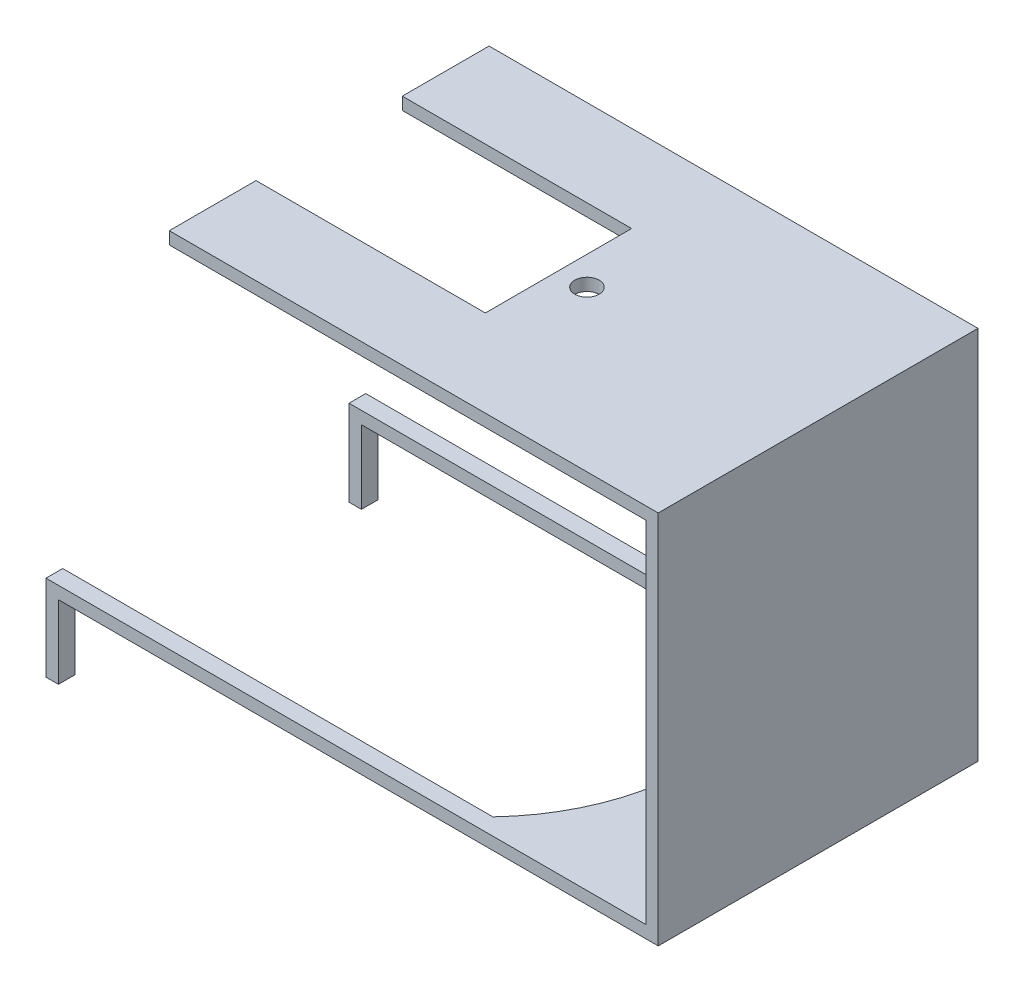
ISO-10303-21;
HEADER;
FILE_DESCRIPTION(('STEP AP214'),'2;1');
FILE_NAME('part.step','',(''),(''),'','','');
FILE_SCHEMA(('AUTOMOTIVE_DESIGN { 1 0 10303 214 1 1 1 1 }'));
ENDSEC;
DATA;
#1=APPLICATION_CONTEXT('core data for automotive mechanical design processes');
#2=APPLICATION_PROTOCOL_DEFINITION('international standard','automotive_design',2000,#1);
#3=PRODUCT_CONTEXT('',#1,'mechanical');
#4=PRODUCT('Part','Part','',(#3));
#5=PRODUCT_RELATED_PRODUCT_CATEGORY('part','',(#4));
#6=PRODUCT_DEFINITION_FORMATION('','',#4);
#7=PRODUCT_DEFINITION_CONTEXT('part definition',#1,'design');
#8=PRODUCT_DEFINITION('design','',#6,#7);
#9=PRODUCT_DEFINITION_SHAPE('','',#8);
#10=(LENGTH_UNIT() NAMED_UNIT(*) SI_UNIT(.MILLI.,.METRE.));
#11=(NAMED_UNIT(*) PLANE_ANGLE_UNIT() SI_UNIT($,.RADIAN.));
#12=(NAMED_UNIT(*) SI_UNIT($,.STERADIAN.) SOLID_ANGLE_UNIT());
#13=UNCERTAINTY_MEASURE_WITH_UNIT(LENGTH_MEASURE(1.E-05),#10,'distance_accuracy_value','');
#14=(GEOMETRIC_REPRESENTATION_CONTEXT(3) GLOBAL_UNCERTAINTY_ASSIGNED_CONTEXT((#13)) GLOBAL_UNIT_ASSIGNED_CONTEXT((#10,
#11,#12)) REPRESENTATION_CONTEXT('',''));
#15=CARTESIAN_POINT('',(0.,0.,0.));
#16=DIRECTION('',(0.,0.,1.));
#17=DIRECTION('',(1.,0.,0.));
#18=AXIS2_PLACEMENT_3D('',#15,#16,#17);
#19=CARTESIAN_POINT('',(-25.3109440696182,-29.7834720622153,25.8));
#20=DIRECTION('',(1.,0.,0.));
#21=DIRECTION('',(0.,0.,-1.));
#22=AXIS2_PLACEMENT_3D('',#19,#20,#21);
#23=PLANE('',#22);
#24=DIRECTION('',(0.,0.,-1.));
#25=VECTOR('',#24,1.);
#26=CARTESIAN_POINT('',(-25.3109440696182,-36.7018237477744,25.8));
#27=LINE('',#26,#25);
#28=CARTESIAN_POINT('',(-25.3109440696182,-36.7018237477745,1.35));
#29=VERTEX_POINT('',#28);
#30=CARTESIAN_POINT('',(-25.3109440696182,-36.7018237477744,0.));
#31=VERTEX_POINT('',#30);
#32=EDGE_CURVE('E196',#29,#31,#27,.T.);
#33=ORIENTED_EDGE('',*,*,#32,.F.);
#34=DIRECTION('',(0.,1.,0.));
#35=VECTOR('',#34,1.);
#36=CARTESIAN_POINT('',(-25.3109440696182,-36.7018237477745,1.35));
#37=LINE('',#36,#35);
#38=CARTESIAN_POINT('',(-25.3109440696182,-29.7834720622153,1.35));
#39=VERTEX_POINT('',#38);
#40=EDGE_CURVE('E233',#29,#39,#37,.T.);
#41=ORIENTED_EDGE('',*,*,#40,.T.);
#42=DIRECTION('',(0.,0.,-1.));
#43=VECTOR('',#42,1.);
#44=CARTESIAN_POINT('',(-25.3109440696182,-29.7834720622153,25.8));
#45=LINE('',#44,#43);
#46=CARTESIAN_POINT('',(-25.3109440696182,-29.7834720622153,0.));
#47=VERTEX_POINT('',#46);
#48=EDGE_CURVE('E195',#39,#47,#45,.T.);
#49=ORIENTED_EDGE('',*,*,#48,.T.);
#50=DIRECTION('',(0.,-1.,0.));
#51=VECTOR('',#50,1.);
#52=CARTESIAN_POINT('',(-25.3109440696182,-29.7834720622153,0.));
#53=LINE('',#52,#51);
#54=EDGE_CURVE('E306',#47,#31,#53,.T.);
#55=ORIENTED_EDGE('',*,*,#54,.T.);
#56=EDGE_LOOP('',(#33,#41,#49,#55));
#57=FACE_BOUND('',#56,.T.);
#58=ADVANCED_FACE('F34',(#57),#23,.F.);
#59=CARTESIAN_POINT('',(-25.3109440696182,-36.7018237477744,25.8));
#60=DIRECTION('',(0.,1.,0.));
#61=DIRECTION('',(-1.,0.,0.));
#62=AXIS2_PLACEMENT_3D('',#59,#60,#61);
#63=PLANE('',#62);
#64=DIRECTION('',(0.,0.,-1.));
#65=VECTOR('',#64,1.);
#66=CARTESIAN_POINT('',(-24.3109440696182,-36.7018237477744,25.8));
#67=LINE('',#66,#65);
#68=CARTESIAN_POINT('',(-24.3109440696182,-36.7018237477745,1.35));
#69=VERTEX_POINT('',#68);
#70=CARTESIAN_POINT('',(-24.3109440696182,-36.7018237477744,0.));
#71=VERTEX_POINT('',#70);
#72=EDGE_CURVE('E324',#69,#71,#67,.T.);
#73=ORIENTED_EDGE('',*,*,#72,.F.);
#74=DIRECTION('',(-1.,0.,0.));
#75=VECTOR('',#74,1.);
#76=CARTESIAN_POINT('',(-25.3109440696182,-36.7018237477745,1.35));
#77=LINE('',#76,#75);
#78=EDGE_CURVE('E180',#69,#29,#77,.T.);
#79=ORIENTED_EDGE('',*,*,#78,.T.);
#80=ORIENTED_EDGE('',*,*,#32,.T.);
#81=DIRECTION('',(1.,0.,0.));
#82=VECTOR('',#81,1.);
#83=CARTESIAN_POINT('',(-25.3109440696182,-36.7018237477744,0.));
#84=LINE('',#83,#82);
#85=EDGE_CURVE('E309',#31,#71,#84,.T.);
#86=ORIENTED_EDGE('',*,*,#85,.T.);
#87=EDGE_LOOP('',(#73,#79,#80,#86));
#88=FACE_BOUND('',#87,.T.);
#89=ADVANCED_FACE('F362',(#88),#63,.F.);
#90=CARTESIAN_POINT('',(-24.3109440696182,-36.7018237477744,25.8));
#91=DIRECTION('',(-1.,0.,0.));
#92=DIRECTION('',(0.,0.,1.));
#93=AXIS2_PLACEMENT_3D('',#90,#91,#92);
#94=PLANE('',#93);
#95=DIRECTION('',(0.,0.,-1.));
#96=VECTOR('',#95,1.);
#97=CARTESIAN_POINT('',(-24.3109440696182,-30.7834720622153,25.8));
#98=LINE('',#97,#96);
#99=CARTESIAN_POINT('',(-24.3109440696182,-30.7834720622153,1.35));
#100=VERTEX_POINT('',#99);
#101=CARTESIAN_POINT('',(-24.3109440696182,-30.7834720622153,0.));
#102=VERTEX_POINT('',#101);
#103=EDGE_CURVE('E322',#100,#102,#98,.T.);
#104=ORIENTED_EDGE('',*,*,#103,.F.);
#105=DIRECTION('',(0.,-1.,0.));
#106=VECTOR('',#105,1.);
#107=CARTESIAN_POINT('',(-24.3109440696182,-36.7018237477744,1.35));
#108=LINE('',#107,#106);
#109=EDGE_CURVE('E241',#100,#69,#108,.T.);
#110=ORIENTED_EDGE('',*,*,#109,.T.);
#111=ORIENTED_EDGE('',*,*,#72,.T.);
#112=DIRECTION('',(0.,1.,0.));
#113=VECTOR('',#112,1.);
#114=CARTESIAN_POINT('',(-24.3109440696182,-36.7018237477744,0.));
#115=LINE('',#114,#113);
#116=EDGE_CURVE('E312',#71,#102,#115,.T.);
#117=ORIENTED_EDGE('',*,*,#116,.T.);
#118=EDGE_LOOP('',(#104,#110,#111,#117));
#119=FACE_BOUND('',#118,.T.);
#120=ADVANCED_FACE('F331',(#119),#94,.F.);
#121=CARTESIAN_POINT('',(-15.3646838899602,-0.528688711027749,25.8));
#122=DIRECTION('',(1.,0.,0.));
#123=DIRECTION('',(0.,0.,-1.));
#124=AXIS2_PLACEMENT_3D('',#121,#122,#123);
#125=PLANE('',#124);
#126=DIRECTION('',(0.,0.,-1.));
#127=VECTOR('',#126,1.);
#128=CARTESIAN_POINT('',(-15.3646838899602,-1.52868871102775,25.8));
#129=LINE('',#128,#127);
#130=CARTESIAN_POINT('',(-15.3646838899602,-1.52868871102775,7.));
#131=VERTEX_POINT('',#130);
#132=CARTESIAN_POINT('',(-15.3646838899602,-1.52868871102775,0.));
#133=VERTEX_POINT('',#132);
#134=EDGE_CURVE('E209',#131,#133,#129,.T.);
#135=ORIENTED_EDGE('',*,*,#134,.F.);
#136=DIRECTION('',(0.,1.,0.));
#137=VECTOR('',#136,1.);
#138=CARTESIAN_POINT('',(-15.3646838899602,-23.4715691053607,7.));
#139=LINE('',#138,#137);
#140=CARTESIAN_POINT('',(-15.3646838899602,-0.528688711027749,7.));
#141=VERTEX_POINT('',#140);
#142=EDGE_CURVE('E265',#131,#141,#139,.T.);
#143=ORIENTED_EDGE('',*,*,#142,.T.);
#144=DIRECTION('',(0.,0.,-1.));
#145=VECTOR('',#144,1.);
#146=CARTESIAN_POINT('',(-15.3646838899602,-0.528688711027749,25.8));
#147=LINE('',#146,#145);
#148=CARTESIAN_POINT('',(-15.3646838899602,-0.528688711027749,0.));
#149=VERTEX_POINT('',#148);
#150=EDGE_CURVE('E213',#141,#149,#147,.T.);
#151=ORIENTED_EDGE('',*,*,#150,.T.);
#152=DIRECTION('',(0.,-1.,0.));
#153=VECTOR('',#152,1.);
#154=CARTESIAN_POINT('',(-15.3646838899602,-0.528688711027749,0.));
#155=LINE('',#154,#153);
#156=EDGE_CURVE('E296',#149,#133,#155,.T.);
#157=ORIENTED_EDGE('',*,*,#156,.T.);
#158=EDGE_LOOP('',(#135,#143,#151,#157));
#159=FACE_BOUND('',#158,.T.);
#160=ADVANCED_FACE('F364',(#159),#125,.F.);
#161=CARTESIAN_POINT('',(24.0848875196476,-0.528688711027744,25.8));
#162=DIRECTION('',(0.,-1.,0.));
#163=DIRECTION('',(1.,0.,0.));
#164=AXIS2_PLACEMENT_3D('',#161,#162,#163);
#165=PLANE('',#164);
#166=CARTESIAN_POINT('',(5.43531611003981,-0.528688711027747,12.9));
#167=DIRECTION('',(0.,1.,0.));
#168=DIRECTION('',(-1.,0.,0.));
#169=AXIS2_PLACEMENT_3D('',#166,#167,#168);
#170=CIRCLE('',#169,0.986321187116857);
#171=CARTESIAN_POINT('',(4.44899492292295,-0.528688711027747,12.9));
#172=VERTEX_POINT('',#171);
#173=EDGE_CURVE('E245',#172,#172,#170,.T.);
#174=ORIENTED_EDGE('',*,*,#173,.F.);
#175=EDGE_LOOP('',(#174));
#176=FACE_BOUND('',#175,.T.);
#177=ORIENTED_EDGE('',*,*,#150,.F.);
#178=DIRECTION('',(-1.,0.,0.));
#179=VECTOR('',#178,1.);
#180=CARTESIAN_POINT('',(3.13531611003981,-0.528688711027747,7.));
#181=LINE('',#180,#179);
#182=CARTESIAN_POINT('',(3.13531611003981,-0.528688711027747,7.));
#183=VERTEX_POINT('',#182);
#184=EDGE_CURVE('E244',#183,#141,#181,.T.);
#185=ORIENTED_EDGE('',*,*,#184,.F.);
#186=DIRECTION('',(0.,0.,-1.));
#187=VECTOR('',#186,1.);
#188=CARTESIAN_POINT('',(3.13531611003981,-0.528688711027747,18.8));
#189=LINE('',#188,#187);
#190=CARTESIAN_POINT('',(3.13531611003981,-0.528688711027747,18.8));
#191=VERTEX_POINT('',#190);
#192=EDGE_CURVE('E262',#191,#183,#189,.T.);
#193=ORIENTED_EDGE('',*,*,#192,.F.);
#194=DIRECTION('',(1.,0.,0.));
#195=VECTOR('',#194,1.);
#196=CARTESIAN_POINT('',(-15.3646838899602,-0.528688711027749,18.8));
#197=LINE('',#196,#195);
#198=CARTESIAN_POINT('',(-15.3646838899602,-0.528688711027749,18.8));
#199=VERTEX_POINT('',#198);
#200=EDGE_CURVE('E260',#199,#191,#197,.T.);
#201=ORIENTED_EDGE('',*,*,#200,.F.);
#202=CARTESIAN_POINT('',(-15.3646838899602,-0.528688711027749,25.8));
#203=VERTEX_POINT('',#202);
#204=EDGE_CURVE('E214',#203,#199,#147,.T.);
#205=ORIENTED_EDGE('',*,*,#204,.F.);
#206=DIRECTION('',(-1.,0.,0.));
#207=VECTOR('',#206,1.);
#208=CARTESIAN_POINT('',(24.0848875196476,-0.528688711027744,25.8));
#209=LINE('',#208,#207);
#210=CARTESIAN_POINT('',(24.0848875196476,-0.528688711027744,25.8));
#211=VERTEX_POINT('',#210);
#212=EDGE_CURVE('E272',#211,#203,#209,.T.);
#213=ORIENTED_EDGE('',*,*,#212,.F.);
#214=DIRECTION('',(0.,0.,-1.));
#215=VECTOR('',#214,1.);
#216=CARTESIAN_POINT('',(24.0848875196476,-0.528688711027744,25.8));
#217=LINE('',#216,#215);
#218=CARTESIAN_POINT('',(24.0848875196476,-0.528688711027744,0.));
#219=VERTEX_POINT('',#218);
#220=EDGE_CURVE('E293',#211,#219,#217,.T.);
#221=ORIENTED_EDGE('',*,*,#220,.T.);
#222=DIRECTION('',(-1.,0.,0.));
#223=VECTOR('',#222,1.);
#224=CARTESIAN_POINT('',(24.0848875196476,-0.528688711027744,0.));
#225=LINE('',#224,#223);
#226=EDGE_CURVE('E252',#219,#149,#225,.T.);
#227=ORIENTED_EDGE('',*,*,#226,.T.);
#228=EDGE_LOOP('',(#177,#185,#193,#201,#205,#213,#221,#227));
#229=FACE_BOUND('',#228,.T.);
#230=ADVANCED_FACE('F36',(#176,#229),#165,.F.);
#231=ORIENTED_EDGE('',*,*,#204,.T.);
#232=DIRECTION('',(0.,1.,0.));
#233=VECTOR('',#232,1.);
#234=CARTESIAN_POINT('',(-15.3646838899602,-23.4715691053607,18.8));
#235=LINE('',#234,#233);
#236=CARTESIAN_POINT('',(-15.3646838899602,-1.52868871102775,18.8));
#237=VERTEX_POINT('',#236);
#238=EDGE_CURVE('E268',#237,#199,#235,.T.);
#239=ORIENTED_EDGE('',*,*,#238,.F.);
#240=CARTESIAN_POINT('',(-15.3646838899602,-1.52868871102775,25.8));
#241=VERTEX_POINT('',#240);
#242=EDGE_CURVE('E210',#241,#237,#129,.T.);
#243=ORIENTED_EDGE('',*,*,#242,.F.);
#244=DIRECTION('',(0.,-1.,0.));
#245=VECTOR('',#244,1.);
#246=CARTESIAN_POINT('',(-15.3646838899602,-0.528688711027749,25.8));
#247=LINE('',#246,#245);
#248=EDGE_CURVE('E275',#203,#241,#247,.T.);
#249=ORIENTED_EDGE('',*,*,#248,.F.);
#250=EDGE_LOOP('',(#231,#239,#243,#249));
#251=FACE_BOUND('',#250,.T.);
#252=ADVANCED_FACE('F390',(#251),#125,.F.);
#253=CARTESIAN_POINT('',(-15.3646838899602,-1.52868871102775,25.8));
#254=DIRECTION('',(0.,1.,0.));
#255=DIRECTION('',(0.,0.,1.));
#256=AXIS2_PLACEMENT_3D('',#253,#254,#255);
#257=PLANE('',#256);
#258=CARTESIAN_POINT('',(5.43531611003981,-1.52868871102775,12.9));
#259=DIRECTION('',(0.,1.,0.));
#260=DIRECTION('',(0.,0.,1.));
#261=AXIS2_PLACEMENT_3D('',#258,#259,#260);
#262=CIRCLE('',#261,0.986321187116857);
#263=CARTESIAN_POINT('',(5.43531611003981,-1.52868871102775,13.8863211871169));
#264=VERTEX_POINT('',#263);
#265=EDGE_CURVE('E248',#264,#264,#262,.F.);
#266=ORIENTED_EDGE('',*,*,#265,.F.);
#267=EDGE_LOOP('',(#266));
#268=FACE_BOUND('',#267,.T.);
#269=DIRECTION('',(0.,0.,1.));
#270=VECTOR('',#269,1.);
#271=CARTESIAN_POINT('',(3.13531611003981,-1.52868871102775,18.8));
#272=LINE('',#271,#270);
#273=CARTESIAN_POINT('',(3.13531611003981,-1.52868871102775,7.));
#274=VERTEX_POINT('',#273);
#275=CARTESIAN_POINT('',(3.13531611003981,-1.52868871102775,18.8));
#276=VERTEX_POINT('',#275);
#277=EDGE_CURVE('E255',#274,#276,#272,.T.);
#278=ORIENTED_EDGE('',*,*,#277,.F.);
#279=DIRECTION('',(1.,0.,0.));
#280=VECTOR('',#279,1.);
#281=CARTESIAN_POINT('',(3.13531611003981,-1.52868871102775,7.));
#282=LINE('',#281,#280);
#283=EDGE_CURVE('E249',#131,#274,#282,.T.);
#284=ORIENTED_EDGE('',*,*,#283,.F.);
#285=ORIENTED_EDGE('',*,*,#134,.T.);
#286=DIRECTION('',(1.,0.,0.));
#287=VECTOR('',#286,1.);
#288=CARTESIAN_POINT('',(-15.3646838899602,-1.52868871102775,0.));
#289=LINE('',#288,#287);
#290=CARTESIAN_POINT('',(23.0848875196476,-1.52868871102775,0.));
#291=VERTEX_POINT('',#290);
#292=EDGE_CURVE('E299',#133,#291,#289,.T.);
#293=ORIENTED_EDGE('',*,*,#292,.T.);
#294=DIRECTION('',(0.,0.,-1.));
#295=VECTOR('',#294,1.);
#296=CARTESIAN_POINT('',(23.0848875196476,-1.52868871102775,25.8));
#297=LINE('',#296,#295);
#298=CARTESIAN_POINT('',(23.0848875196476,-1.52868871102775,25.8));
#299=VERTEX_POINT('',#298);
#300=EDGE_CURVE('E206',#299,#291,#297,.T.);
#301=ORIENTED_EDGE('',*,*,#300,.F.);
#302=DIRECTION('',(1.,0.,0.));
#303=VECTOR('',#302,1.);
#304=CARTESIAN_POINT('',(-15.3646838899602,-1.52868871102775,25.8));
#305=LINE('',#304,#303);
#306=EDGE_CURVE('E278',#241,#299,#305,.T.);
#307=ORIENTED_EDGE('',*,*,#306,.F.);
#308=ORIENTED_EDGE('',*,*,#242,.T.);
#309=DIRECTION('',(-1.,0.,0.));
#310=VECTOR('',#309,1.);
#311=CARTESIAN_POINT('',(-15.3646838899602,-1.52868871102775,18.8));
#312=LINE('',#311,#310);
#313=EDGE_CURVE('E253',#276,#237,#312,.T.);
#314=ORIENTED_EDGE('',*,*,#313,.F.);
#315=EDGE_LOOP('',(#278,#284,#285,#293,#301,#307,#308,#314));
#316=FACE_BOUND('',#315,.T.);
#317=ADVANCED_FACE('F384',(#268,#316),#257,.F.);
#318=CARTESIAN_POINT('',(23.0848875196476,-1.52868871102775,25.8));
#319=DIRECTION('',(1.,0.,0.));
#320=DIRECTION('',(0.,1.,0.));
#321=AXIS2_PLACEMENT_3D('',#318,#319,#320);
#322=PLANE('',#321);
#323=DIRECTION('',(0.,-1.,0.));
#324=VECTOR('',#323,1.);
#325=CARTESIAN_POINT('',(23.0848875196476,-1.52868871102775,0.));
#326=LINE('',#325,#324);
#327=CARTESIAN_POINT('',(23.0848875196476,-29.7834720622153,0.));
#328=VERTEX_POINT('',#327);
#329=EDGE_CURVE('E301',#291,#328,#326,.T.);
#330=ORIENTED_EDGE('',*,*,#329,.T.);
#331=DIRECTION('',(0.,0.,-1.));
#332=VECTOR('',#331,1.);
#333=CARTESIAN_POINT('',(23.0848875196476,-29.7834720622153,25.8));
#334=LINE('',#333,#332);
#335=CARTESIAN_POINT('',(23.0848875196476,-29.7834720622153,25.8));
#336=VERTEX_POINT('',#335);
#337=EDGE_CURVE('E203',#336,#328,#334,.T.);
#338=ORIENTED_EDGE('',*,*,#337,.F.);
#339=DIRECTION('',(0.,-1.,0.));
#340=VECTOR('',#339,1.);
#341=CARTESIAN_POINT('',(23.0848875196476,-1.52868871102775,25.8));
#342=LINE('',#341,#340);
#343=EDGE_CURVE('E280',#299,#336,#342,.T.);
#344=ORIENTED_EDGE('',*,*,#343,.F.);
#345=ORIENTED_EDGE('',*,*,#300,.T.);
#346=EDGE_LOOP('',(#330,#338,#344,#345));
#347=FACE_BOUND('',#346,.T.);
#348=ADVANCED_FACE('F379',(#347),#322,.F.);
#349=CARTESIAN_POINT('',(23.0848875196476,-29.7834720622153,25.8));
#350=DIRECTION('',(0.,-1.,0.));
#351=DIRECTION('',(1.,0.,0.));
#352=AXIS2_PLACEMENT_3D('',#349,#350,#351);
#353=PLANE('',#352);
#354=ORIENTED_EDGE('',*,*,#48,.F.);
#355=DIRECTION('',(-1.,0.,0.));
#356=VECTOR('',#355,1.);
#357=CARTESIAN_POINT('',(-25.3109440696182,-29.7834720622153,1.35));
#358=LINE('',#357,#356);
#359=CARTESIAN_POINT('',(9.39139752926901,-29.7834720622153,1.35));
#360=VERTEX_POINT('',#359);
#361=EDGE_CURVE('E181',#360,#39,#358,.T.);
#362=ORIENTED_EDGE('',*,*,#361,.F.);
#363=CARTESIAN_POINT('',(-2.7809440696182,-29.7834720622153,12.9));
#364=DIRECTION('',(0.,1.,0.));
#365=DIRECTION('',(-1.,0.,0.));
#366=AXIS2_PLACEMENT_3D('',#363,#364,#365);
#367=CIRCLE('',#366,16.78);
#368=CARTESIAN_POINT('',(9.39139752926902,-29.7834720622153,24.45));
#369=VERTEX_POINT('',#368);
#370=EDGE_CURVE('E230',#369,#360,#367,.T.);
#371=ORIENTED_EDGE('',*,*,#370,.F.);
#372=DIRECTION('',(1.,0.,0.));
#373=VECTOR('',#372,1.);
#374=CARTESIAN_POINT('',(9.39139752926902,-29.7834720622153,24.45));
#375=LINE('',#374,#373);
#376=CARTESIAN_POINT('',(-25.3109440696182,-29.7834720622153,24.45));
#377=VERTEX_POINT('',#376);
#378=EDGE_CURVE('E544',#377,#369,#375,.T.);
#379=ORIENTED_EDGE('',*,*,#378,.F.);
#380=CARTESIAN_POINT('',(-25.3109440696182,-29.7834720622153,25.8));
#381=VERTEX_POINT('',#380);
#382=EDGE_CURVE('E191',#381,#377,#45,.T.);
#383=ORIENTED_EDGE('',*,*,#382,.F.);
#384=DIRECTION('',(-1.,0.,0.));
#385=VECTOR('',#384,1.);
#386=CARTESIAN_POINT('',(23.0848875196476,-29.7834720622153,25.8));
#387=LINE('',#386,#385);
#388=EDGE_CURVE('E282',#336,#381,#387,.T.);
#389=ORIENTED_EDGE('',*,*,#388,.F.);
#390=ORIENTED_EDGE('',*,*,#337,.T.);
#391=DIRECTION('',(-1.,0.,0.));
#392=VECTOR('',#391,1.);
#393=CARTESIAN_POINT('',(23.0848875196476,-29.7834720622153,0.));
#394=LINE('',#393,#392);
#395=EDGE_CURVE('E303',#328,#47,#394,.T.);
#396=ORIENTED_EDGE('',*,*,#395,.T.);
#397=EDGE_LOOP('',(#354,#362,#371,#379,#383,#389,#390,#396));
#398=FACE_BOUND('',#397,.T.);
#399=ADVANCED_FACE('F375',(#398),#353,.F.);
#400=ORIENTED_EDGE('',*,*,#382,.T.);
#401=DIRECTION('',(0.,1.,0.));
#402=VECTOR('',#401,1.);
#403=CARTESIAN_POINT('',(-25.3109440696182,-36.7018237477745,24.45));
#404=LINE('',#403,#402);
#405=CARTESIAN_POINT('',(-25.3109440696182,-36.7018237477745,24.45));
#406=VERTEX_POINT('',#405);
#407=EDGE_CURVE('E172',#406,#377,#404,.T.);
#408=ORIENTED_EDGE('',*,*,#407,.F.);
#409=CARTESIAN_POINT('',(-25.3109440696182,-36.7018237477744,25.8));
#410=VERTEX_POINT('',#409);
#411=EDGE_CURVE('E188',#410,#406,#27,.T.);
#412=ORIENTED_EDGE('',*,*,#411,.F.);
#413=DIRECTION('',(0.,-1.,0.));
#414=VECTOR('',#413,1.);
#415=CARTESIAN_POINT('',(-25.3109440696182,-29.7834720622153,25.8));
#416=LINE('',#415,#414);
#417=EDGE_CURVE('E284',#381,#410,#416,.T.);
#418=ORIENTED_EDGE('',*,*,#417,.F.);
#419=EDGE_LOOP('',(#400,#408,#412,#418));
#420=FACE_BOUND('',#419,.T.);
#421=ADVANCED_FACE('F186',(#420),#23,.F.);
#422=ORIENTED_EDGE('',*,*,#411,.T.);
#423=DIRECTION('',(1.,0.,0.));
#424=VECTOR('',#423,1.);
#425=CARTESIAN_POINT('',(9.39139752926902,-36.7018237477744,24.45));
#426=LINE('',#425,#424);
#427=CARTESIAN_POINT('',(-24.3109440696182,-36.7018237477744,24.45));
#428=VERTEX_POINT('',#427);
#429=EDGE_CURVE('E169',#406,#428,#426,.T.);
#430=ORIENTED_EDGE('',*,*,#429,.T.);
#431=CARTESIAN_POINT('',(-24.3109440696182,-36.7018237477744,25.8));
#432=VERTEX_POINT('',#431);
#433=EDGE_CURVE('E199',#432,#428,#67,.T.);
#434=ORIENTED_EDGE('',*,*,#433,.F.);
#435=DIRECTION('',(1.,0.,0.));
#436=VECTOR('',#435,1.);
#437=CARTESIAN_POINT('',(-25.3109440696182,-36.7018237477744,25.8));
#438=LINE('',#437,#436);
#439=EDGE_CURVE('E194',#410,#432,#438,.T.);
#440=ORIENTED_EDGE('',*,*,#439,.F.);
#441=EDGE_LOOP('',(#422,#430,#434,#440));
#442=FACE_BOUND('',#441,.T.);
#443=ADVANCED_FACE('F193',(#442),#63,.F.);
#444=ORIENTED_EDGE('',*,*,#433,.T.);
#445=DIRECTION('',(0.,1.,0.));
#446=VECTOR('',#445,1.);
#447=CARTESIAN_POINT('',(-24.3109440696182,-36.7018237477744,24.45));
#448=LINE('',#447,#446);
#449=CARTESIAN_POINT('',(-24.3109440696182,-30.7834720622153,24.45));
#450=VERTEX_POINT('',#449);
#451=EDGE_CURVE('E175',#428,#450,#448,.T.);
#452=ORIENTED_EDGE('',*,*,#451,.T.);
#453=CARTESIAN_POINT('',(-24.3109440696182,-30.7834720622153,25.8));
#454=VERTEX_POINT('',#453);
#455=EDGE_CURVE('E323',#454,#450,#98,.T.);
#456=ORIENTED_EDGE('',*,*,#455,.F.);
#457=DIRECTION('',(0.,1.,0.));
#458=VECTOR('',#457,1.);
#459=CARTESIAN_POINT('',(-24.3109440696182,-36.7018237477744,25.8));
#460=LINE('',#459,#458);
#461=EDGE_CURVE('E287',#432,#454,#460,.T.);
#462=ORIENTED_EDGE('',*,*,#461,.F.);
#463=EDGE_LOOP('',(#444,#452,#456,#462));
#464=FACE_BOUND('',#463,.T.);
#465=ADVANCED_FACE('F353',(#464),#94,.F.);
#466=CARTESIAN_POINT('',(-24.3109440696182,-30.7834720622153,25.8));
#467=DIRECTION('',(0.,1.,0.));
#468=DIRECTION('',(0.,0.,1.));
#469=AXIS2_PLACEMENT_3D('',#466,#467,#468);
#470=PLANE('',#469);
#471=CARTESIAN_POINT('',(-2.7809440696182,-30.7834720622153,12.9));
#472=DIRECTION('',(0.,1.,0.));
#473=DIRECTION('',(0.,0.,1.));
#474=AXIS2_PLACEMENT_3D('',#471,#472,#473);
#475=CIRCLE('',#474,16.78);
#476=CARTESIAN_POINT('',(9.39139752926901,-30.7834720622153,24.45));
#477=VERTEX_POINT('',#476);
#478=CARTESIAN_POINT('',(9.39139752926901,-30.7834720622153,1.35));
#479=VERTEX_POINT('',#478);
#480=EDGE_CURVE('E42',#477,#479,#475,.T.);
#481=ORIENTED_EDGE('',*,*,#480,.T.);
#482=DIRECTION('',(-1.,0.,0.));
#483=VECTOR('',#482,1.);
#484=CARTESIAN_POINT('',(-24.3109440696182,-30.7834720622153,1.35));
#485=LINE('',#484,#483);
#486=EDGE_CURVE('E11',#479,#100,#485,.T.);
#487=ORIENTED_EDGE('',*,*,#486,.T.);
#488=ORIENTED_EDGE('',*,*,#103,.T.);
#489=DIRECTION('',(1.,0.,0.));
#490=VECTOR('',#489,1.);
#491=CARTESIAN_POINT('',(-24.3109440696182,-30.7834720622153,0.));
#492=LINE('',#491,#490);
#493=CARTESIAN_POINT('',(24.0848875196476,-30.7834720622153,0.));
#494=VERTEX_POINT('',#493);
#495=EDGE_CURVE('E315',#102,#494,#492,.T.);
#496=ORIENTED_EDGE('',*,*,#495,.T.);
#497=DIRECTION('',(0.,0.,-1.));
#498=VECTOR('',#497,1.);
#499=CARTESIAN_POINT('',(24.0848875196476,-30.7834720622153,25.8));
#500=LINE('',#499,#498);
#501=CARTESIAN_POINT('',(24.0848875196476,-30.7834720622153,25.8));
#502=VERTEX_POINT('',#501);
#503=EDGE_CURVE('E320',#502,#494,#500,.T.);
#504=ORIENTED_EDGE('',*,*,#503,.F.);
#505=DIRECTION('',(1.,0.,0.));
#506=VECTOR('',#505,1.);
#507=CARTESIAN_POINT('',(-24.3109440696182,-30.7834720622153,25.8));
#508=LINE('',#507,#506);
#509=EDGE_CURVE('E289',#454,#502,#508,.T.);
#510=ORIENTED_EDGE('',*,*,#509,.F.);
#511=ORIENTED_EDGE('',*,*,#455,.T.);
#512=DIRECTION('',(1.,0.,0.));
#513=VECTOR('',#512,1.);
#514=CARTESIAN_POINT('',(-24.3109440696182,-30.7834720622153,24.45));
#515=LINE('',#514,#513);
#516=EDGE_CURVE('E217',#450,#477,#515,.T.);
#517=ORIENTED_EDGE('',*,*,#516,.T.);
#518=EDGE_LOOP('',(#481,#487,#488,#496,#504,#510,#511,#517));
#519=FACE_BOUND('',#518,.T.);
#520=ADVANCED_FACE('F221',(#519),#470,.F.);
#521=CARTESIAN_POINT('',(24.0848875196476,-30.7834720622153,25.8));
#522=DIRECTION('',(-1.,0.,0.));
#523=DIRECTION('',(0.,0.,1.));
#524=AXIS2_PLACEMENT_3D('',#521,#522,#523);
#525=PLANE('',#524);
#526=DIRECTION('',(0.,1.,0.));
#527=VECTOR('',#526,1.);
#528=CARTESIAN_POINT('',(24.0848875196476,-30.7834720622153,0.));
#529=LINE('',#528,#527);
#530=EDGE_CURVE('E276',#494,#219,#529,.T.);
#531=ORIENTED_EDGE('',*,*,#530,.T.);
#532=ORIENTED_EDGE('',*,*,#220,.F.);
#533=DIRECTION('',(0.,1.,0.));
#534=VECTOR('',#533,1.);
#535=CARTESIAN_POINT('',(24.0848875196476,-30.7834720622153,25.8));
#536=LINE('',#535,#534);
#537=EDGE_CURVE('E291',#502,#211,#536,.T.);
#538=ORIENTED_EDGE('',*,*,#537,.F.);
#539=ORIENTED_EDGE('',*,*,#503,.T.);
#540=EDGE_LOOP('',(#531,#532,#538,#539));
#541=FACE_BOUND('',#540,.T.);
#542=ADVANCED_FACE('F341',(#541),#525,.F.);
#543=CARTESIAN_POINT('',(0.,0.,25.8));
#544=DIRECTION('',(0.,0.,1.));
#545=DIRECTION('',(1.,0.,0.));
#546=AXIS2_PLACEMENT_3D('',#543,#544,#545);
#547=PLANE('',#546);
#548=ORIENTED_EDGE('',*,*,#212,.T.);
#549=ORIENTED_EDGE('',*,*,#248,.T.);
#550=ORIENTED_EDGE('',*,*,#306,.T.);
#551=ORIENTED_EDGE('',*,*,#343,.T.);
#552=ORIENTED_EDGE('',*,*,#388,.T.);
#553=ORIENTED_EDGE('',*,*,#417,.T.);
#554=ORIENTED_EDGE('',*,*,#439,.T.);
#555=ORIENTED_EDGE('',*,*,#461,.T.);
#556=ORIENTED_EDGE('',*,*,#509,.T.);
#557=ORIENTED_EDGE('',*,*,#537,.T.);
#558=EDGE_LOOP('',(#548,#549,#550,#551,#552,#553,#554,#555,#556,#557));
#559=FACE_BOUND('',#558,.T.);
#560=ADVANCED_FACE('F349',(#559),#547,.T.);
#561=CARTESIAN_POINT('',(0.,0.,0.));
#562=DIRECTION('',(0.,0.,1.));
#563=DIRECTION('',(1.,0.,0.));
#564=AXIS2_PLACEMENT_3D('',#561,#562,#563);
#565=PLANE('',#564);
#566=ORIENTED_EDGE('',*,*,#226,.F.);
#567=ORIENTED_EDGE('',*,*,#530,.F.);
#568=ORIENTED_EDGE('',*,*,#495,.F.);
#569=ORIENTED_EDGE('',*,*,#116,.F.);
#570=ORIENTED_EDGE('',*,*,#85,.F.);
#571=ORIENTED_EDGE('',*,*,#54,.F.);
#572=ORIENTED_EDGE('',*,*,#395,.F.);
#573=ORIENTED_EDGE('',*,*,#329,.F.);
#574=ORIENTED_EDGE('',*,*,#292,.F.);
#575=ORIENTED_EDGE('',*,*,#156,.F.);
#576=EDGE_LOOP('',(#566,#567,#568,#569,#570,#571,#572,#573,#574,#575));
#577=FACE_BOUND('',#576,.T.);
#578=ADVANCED_FACE('F337',(#577),#565,.F.);
#579=CARTESIAN_POINT('',(3.13531611003981,-23.4715691053607,7.));
#580=DIRECTION('',(0.,0.,-1.));
#581=DIRECTION('',(-1.,0.,0.));
#582=AXIS2_PLACEMENT_3D('',#579,#580,#581);
#583=PLANE('',#582);
#584=ORIENTED_EDGE('',*,*,#283,.T.);
#585=DIRECTION('',(0.,1.,0.));
#586=VECTOR('',#585,1.);
#587=CARTESIAN_POINT('',(3.13531611003981,-23.4715691053607,7.));
#588=LINE('',#587,#586);
#589=EDGE_CURVE('E256',#274,#183,#588,.T.);
#590=ORIENTED_EDGE('',*,*,#589,.T.);
#591=ORIENTED_EDGE('',*,*,#184,.T.);
#592=ORIENTED_EDGE('',*,*,#142,.F.);
#593=EDGE_LOOP('',(#584,#590,#591,#592));
#594=FACE_BOUND('',#593,.T.);
#595=ADVANCED_FACE('F411',(#594),#583,.F.);
#596=CARTESIAN_POINT('',(3.13531611003981,-23.4715691053607,18.8));
#597=DIRECTION('',(1.,0.,0.));
#598=DIRECTION('',(0.,0.,-1.));
#599=AXIS2_PLACEMENT_3D('',#596,#597,#598);
#600=PLANE('',#599);
#601=ORIENTED_EDGE('',*,*,#277,.T.);
#602=DIRECTION('',(0.,1.,0.));
#603=VECTOR('',#602,1.);
#604=CARTESIAN_POINT('',(3.13531611003981,-23.4715691053607,18.8));
#605=LINE('',#604,#603);
#606=EDGE_CURVE('E57',#276,#191,#605,.T.);
#607=ORIENTED_EDGE('',*,*,#606,.T.);
#608=ORIENTED_EDGE('',*,*,#192,.T.);
#609=ORIENTED_EDGE('',*,*,#589,.F.);
#610=EDGE_LOOP('',(#601,#607,#608,#609));
#611=FACE_BOUND('',#610,.T.);
#612=ADVANCED_FACE('F413',(#611),#600,.F.);
#613=CARTESIAN_POINT('',(-15.3646838899602,-23.4715691053607,18.8));
#614=DIRECTION('',(0.,0.,1.));
#615=DIRECTION('',(1.,0.,0.));
#616=AXIS2_PLACEMENT_3D('',#613,#614,#615);
#617=PLANE('',#616);
#618=ORIENTED_EDGE('',*,*,#313,.T.);
#619=ORIENTED_EDGE('',*,*,#238,.T.);
#620=ORIENTED_EDGE('',*,*,#200,.T.);
#621=ORIENTED_EDGE('',*,*,#606,.F.);
#622=EDGE_LOOP('',(#618,#619,#620,#621));
#623=FACE_BOUND('',#622,.T.);
#624=ADVANCED_FACE('F424',(#623),#617,.F.);
#625=CARTESIAN_POINT('',(5.43531611003981,-23.4715691053607,12.9));
#626=DIRECTION('',(0.,1.,0.));
#627=DIRECTION('',(-1.,0.,0.));
#628=AXIS2_PLACEMENT_3D('',#625,#626,#627);
#629=CYLINDRICAL_SURFACE('',#628,0.986321187116857);
#630=ORIENTED_EDGE('',*,*,#265,.T.);
#631=EDGE_LOOP('',(#630));
#632=FACE_BOUND('',#631,.T.);
#633=ORIENTED_EDGE('',*,*,#173,.T.);
#634=EDGE_LOOP('',(#633));
#635=FACE_BOUND('',#634,.T.);
#636=ADVANCED_FACE('F426',(#632,#635),#629,.F.);
#637=CARTESIAN_POINT('',(-25.3109440696182,-36.7018237477745,1.35));
#638=DIRECTION('',(0.,0.,-1.));
#639=DIRECTION('',(-1.,0.,0.));
#640=AXIS2_PLACEMENT_3D('',#637,#638,#639);
#641=PLANE('',#640);
#642=ORIENTED_EDGE('',*,*,#486,.F.);
#643=DIRECTION('',(0.,1.,0.));
#644=VECTOR('',#643,1.);
#645=CARTESIAN_POINT('',(9.39139752926901,-36.7018237477744,1.35));
#646=LINE('',#645,#644);
#647=EDGE_CURVE('E228',#479,#360,#646,.T.);
#648=ORIENTED_EDGE('',*,*,#647,.T.);
#649=ORIENTED_EDGE('',*,*,#361,.T.);
#650=ORIENTED_EDGE('',*,*,#40,.F.);
#651=ORIENTED_EDGE('',*,*,#78,.F.);
#652=ORIENTED_EDGE('',*,*,#109,.F.);
#653=EDGE_LOOP('',(#642,#648,#649,#650,#651,#652));
#654=FACE_BOUND('',#653,.T.);
#655=ADVANCED_FACE('F432',(#654),#641,.F.);
#656=CARTESIAN_POINT('',(-2.7809440696182,-36.7018237477744,12.9));
#657=DIRECTION('',(0.,1.,0.));
#658=DIRECTION('',(-1.,0.,0.));
#659=AXIS2_PLACEMENT_3D('',#656,#657,#658);
#660=CYLINDRICAL_SURFACE('',#659,16.78);
#661=DIRECTION('',(0.,1.,0.));
#662=VECTOR('',#661,1.);
#663=CARTESIAN_POINT('',(9.39139752926902,-36.7018237477744,24.45));
#664=LINE('',#663,#662);
#665=EDGE_CURVE('E49',#477,#369,#664,.T.);
#666=ORIENTED_EDGE('',*,*,#665,.T.);
#667=ORIENTED_EDGE('',*,*,#370,.T.);
#668=ORIENTED_EDGE('',*,*,#647,.F.);
#669=ORIENTED_EDGE('',*,*,#480,.F.);
#670=EDGE_LOOP('',(#666,#667,#668,#669));
#671=FACE_BOUND('',#670,.T.);
#672=ADVANCED_FACE('F226',(#671),#660,.F.);
#673=CARTESIAN_POINT('',(9.39139752926902,-36.7018237477744,24.45));
#674=DIRECTION('',(0.,0.,1.));
#675=DIRECTION('',(1.,0.,0.));
#676=AXIS2_PLACEMENT_3D('',#673,#674,#675);
#677=PLANE('',#676);
#678=ORIENTED_EDGE('',*,*,#429,.F.);
#679=ORIENTED_EDGE('',*,*,#407,.T.);
#680=ORIENTED_EDGE('',*,*,#378,.T.);
#681=ORIENTED_EDGE('',*,*,#665,.F.);
#682=ORIENTED_EDGE('',*,*,#516,.F.);
#683=ORIENTED_EDGE('',*,*,#451,.F.);
#684=EDGE_LOOP('',(#678,#679,#680,#681,#682,#683));
#685=FACE_BOUND('',#684,.T.);
#686=ADVANCED_FACE('F171',(#685),#677,.F.);
#687=CLOSED_SHELL('',(#58,#89,#120,#160,#230,#252,#317,#348,#399,#421,#443,#465,#520,#542,#560,
#578,#595,#612,#624,#636,#655,#672,#686));
#688=MANIFOLD_SOLID_BREP('B2',#687);
#689=ADVANCED_BREP_SHAPE_REPRESENTATION('',(#18,#688),#14);
#690=SHAPE_DEFINITION_REPRESENTATION(#9,#689);
ENDSEC;
END-ISO-10303-21;
